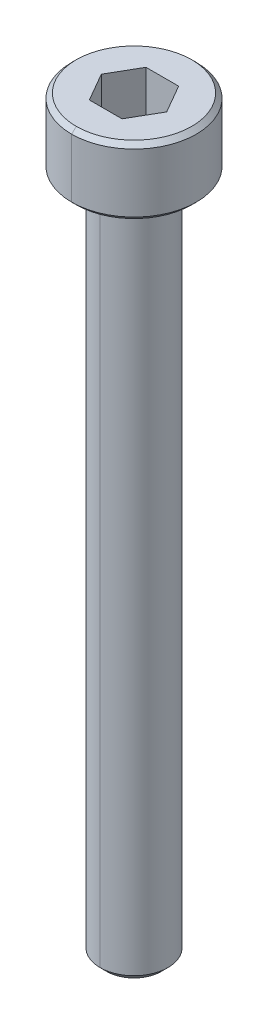
ISO-10303-21;
HEADER;
FILE_DESCRIPTION(('STEP AP214'),'2;1');
FILE_NAME('part.step','',(''),(''),'','','');
FILE_SCHEMA(('AUTOMOTIVE_DESIGN { 1 0 10303 214 1 1 1 1 }'));
ENDSEC;
DATA;
#1=APPLICATION_CONTEXT('core data for automotive mechanical design processes');
#2=APPLICATION_PROTOCOL_DEFINITION('international standard','automotive_design',2000,#1);
#3=PRODUCT_CONTEXT('',#1,'mechanical');
#4=PRODUCT('Part','Part','',(#3));
#5=PRODUCT_RELATED_PRODUCT_CATEGORY('part','',(#4));
#6=PRODUCT_DEFINITION_FORMATION('','',#4);
#7=PRODUCT_DEFINITION_CONTEXT('part definition',#1,'design');
#8=PRODUCT_DEFINITION('design','',#6,#7);
#9=PRODUCT_DEFINITION_SHAPE('','',#8);
#10=(LENGTH_UNIT() NAMED_UNIT(*) SI_UNIT(.MILLI.,.METRE.));
#11=(NAMED_UNIT(*) PLANE_ANGLE_UNIT() SI_UNIT($,.RADIAN.));
#12=(NAMED_UNIT(*) SI_UNIT($,.STERADIAN.) SOLID_ANGLE_UNIT());
#13=UNCERTAINTY_MEASURE_WITH_UNIT(LENGTH_MEASURE(1.E-05),#10,'distance_accuracy_value','');
#14=(GEOMETRIC_REPRESENTATION_CONTEXT(3) GLOBAL_UNCERTAINTY_ASSIGNED_CONTEXT((#13)) GLOBAL_UNIT_ASSIGNED_CONTEXT((#10,
#11,#12)) REPRESENTATION_CONTEXT('',''));
#15=CARTESIAN_POINT('',(0.,0.,0.));
#16=DIRECTION('',(0.,0.,1.));
#17=DIRECTION('',(1.,0.,0.));
#18=AXIS2_PLACEMENT_3D('',#15,#16,#17);
#19=CARTESIAN_POINT('',(0.721687836487033,31.,1.25));
#20=DIRECTION('',(0.866025403784439,0.,0.5));
#21=DIRECTION('',(0.5,0.,-0.866025403784439));
#22=AXIS2_PLACEMENT_3D('',#19,#20,#21);
#23=PLANE('',#22);
#24=DIRECTION('',(0.5,0.,-0.866025403784439));
#25=VECTOR('',#24,1.);
#26=CARTESIAN_POINT('',(0.721687836487033,31.,1.25));
#27=LINE('',#26,#25);
#28=CARTESIAN_POINT('',(0.721687836487033,31.,1.25));
#29=VERTEX_POINT('',#28);
#30=CARTESIAN_POINT('',(1.44337567297406,31.,0.));
#31=VERTEX_POINT('',#30);
#32=EDGE_CURVE('E179',#29,#31,#27,.T.);
#33=ORIENTED_EDGE('',*,*,#32,.F.);
#34=DIRECTION('',(0.,1.,0.));
#35=VECTOR('',#34,1.);
#36=CARTESIAN_POINT('',(0.721687836487033,31.,1.25));
#37=LINE('',#36,#35);
#38=CARTESIAN_POINT('',(0.721687836487033,33.,1.25));
#39=VERTEX_POINT('',#38);
#40=EDGE_CURVE('E167',#29,#39,#37,.T.);
#41=ORIENTED_EDGE('',*,*,#40,.T.);
#42=DIRECTION('',(0.5,0.,-0.866025403784439));
#43=VECTOR('',#42,1.);
#44=CARTESIAN_POINT('',(0.721687836487033,33.,1.25));
#45=LINE('',#44,#43);
#46=CARTESIAN_POINT('',(1.44337567297406,33.,0.));
#47=VERTEX_POINT('',#46);
#48=EDGE_CURVE('E181',#47,#39,#45,.F.);
#49=ORIENTED_EDGE('',*,*,#48,.F.);
#50=DIRECTION('',(0.,1.,0.));
#51=VECTOR('',#50,1.);
#52=CARTESIAN_POINT('',(1.44337567297406,31.,0.));
#53=LINE('',#52,#51);
#54=EDGE_CURVE('E174',#47,#31,#53,.F.);
#55=ORIENTED_EDGE('',*,*,#54,.T.);
#56=EDGE_LOOP('',(#33,#41,#49,#55));
#57=FACE_BOUND('',#56,.T.);
#58=ADVANCED_FACE('F17',(#57),#23,.F.);
#59=CARTESIAN_POINT('',(1.44337567297406,31.,0.));
#60=DIRECTION('',(0.866025403784438,0.,-0.5));
#61=DIRECTION('',(-0.5,0.,-0.866025403784438));
#62=AXIS2_PLACEMENT_3D('',#59,#60,#61);
#63=PLANE('',#62);
#64=DIRECTION('',(-0.5,0.,-0.866025403784438));
#65=VECTOR('',#64,1.);
#66=CARTESIAN_POINT('',(1.44337567297406,31.,0.));
#67=LINE('',#66,#65);
#68=CARTESIAN_POINT('',(0.721687836487031,31.,-1.25));
#69=VERTEX_POINT('',#68);
#70=EDGE_CURVE('E172',#31,#69,#67,.T.);
#71=ORIENTED_EDGE('',*,*,#70,.F.);
#72=ORIENTED_EDGE('',*,*,#54,.F.);
#73=DIRECTION('',(-0.5,0.,-0.866025403784438));
#74=VECTOR('',#73,1.);
#75=CARTESIAN_POINT('',(1.44337567297406,33.,0.));
#76=LINE('',#75,#74);
#77=CARTESIAN_POINT('',(0.721687836487032,33.,-1.25));
#78=VERTEX_POINT('',#77);
#79=EDGE_CURVE('E177',#78,#47,#76,.F.);
#80=ORIENTED_EDGE('',*,*,#79,.F.);
#81=DIRECTION('',(0.,1.,0.));
#82=VECTOR('',#81,1.);
#83=CARTESIAN_POINT('',(0.721687836487031,31.,-1.25));
#84=LINE('',#83,#82);
#85=EDGE_CURVE('E162',#78,#69,#84,.F.);
#86=ORIENTED_EDGE('',*,*,#85,.T.);
#87=EDGE_LOOP('',(#71,#72,#80,#86));
#88=FACE_BOUND('',#87,.T.);
#89=ADVANCED_FACE('F417',(#88),#63,.F.);
#90=CARTESIAN_POINT('',(-0.721687836487032,31.,1.25));
#91=DIRECTION('',(0.,0.,1.));
#92=DIRECTION('',(1.,0.,0.));
#93=AXIS2_PLACEMENT_3D('',#90,#91,#92);
#94=PLANE('',#93);
#95=DIRECTION('',(1.,0.,0.));
#96=VECTOR('',#95,1.);
#97=CARTESIAN_POINT('',(1.44337567297406,31.,1.25));
#98=LINE('',#97,#96);
#99=CARTESIAN_POINT('',(-0.721687836487032,31.,1.25));
#100=VERTEX_POINT('',#99);
#101=EDGE_CURVE('E159',#100,#29,#98,.T.);
#102=ORIENTED_EDGE('',*,*,#101,.F.);
#103=DIRECTION('',(0.,1.,0.));
#104=VECTOR('',#103,1.);
#105=CARTESIAN_POINT('',(-0.721687836487032,31.,1.25));
#106=LINE('',#105,#104);
#107=CARTESIAN_POINT('',(-0.721687836487032,33.,1.25));
#108=VERTEX_POINT('',#107);
#109=EDGE_CURVE('E148',#100,#108,#106,.T.);
#110=ORIENTED_EDGE('',*,*,#109,.T.);
#111=DIRECTION('',(1.,0.,0.));
#112=VECTOR('',#111,1.);
#113=CARTESIAN_POINT('',(-0.721687836487032,33.,1.25));
#114=LINE('',#113,#112);
#115=EDGE_CURVE('E170',#39,#108,#114,.F.);
#116=ORIENTED_EDGE('',*,*,#115,.F.);
#117=ORIENTED_EDGE('',*,*,#40,.F.);
#118=EDGE_LOOP('',(#102,#110,#116,#117));
#119=FACE_BOUND('',#118,.T.);
#120=ADVANCED_FACE('F408',(#119),#94,.F.);
#121=CARTESIAN_POINT('',(0.721687836487031,31.,-1.25));
#122=DIRECTION('',(0.,0.,-1.));
#123=DIRECTION('',(-1.,0.,0.));
#124=AXIS2_PLACEMENT_3D('',#121,#122,#123);
#125=PLANE('',#124);
#126=DIRECTION('',(1.,0.,0.));
#127=VECTOR('',#126,1.);
#128=CARTESIAN_POINT('',(1.44337567297406,31.,-1.25));
#129=LINE('',#128,#127);
#130=CARTESIAN_POINT('',(-0.721687836487032,31.,-1.25));
#131=VERTEX_POINT('',#130);
#132=EDGE_CURVE('E156',#69,#131,#129,.F.);
#133=ORIENTED_EDGE('',*,*,#132,.F.);
#134=ORIENTED_EDGE('',*,*,#85,.F.);
#135=DIRECTION('',(-1.,0.,0.));
#136=VECTOR('',#135,1.);
#137=CARTESIAN_POINT('',(0.721687836487031,33.,-1.25));
#138=LINE('',#137,#136);
#139=CARTESIAN_POINT('',(-0.721687836487032,33.,-1.25));
#140=VERTEX_POINT('',#139);
#141=EDGE_CURVE('E165',#140,#78,#138,.F.);
#142=ORIENTED_EDGE('',*,*,#141,.F.);
#143=DIRECTION('',(0.,1.,0.));
#144=VECTOR('',#143,1.);
#145=CARTESIAN_POINT('',(-0.721687836487032,31.,-1.25));
#146=LINE('',#145,#144);
#147=EDGE_CURVE('E146',#140,#131,#146,.F.);
#148=ORIENTED_EDGE('',*,*,#147,.T.);
#149=EDGE_LOOP('',(#133,#134,#142,#148));
#150=FACE_BOUND('',#149,.T.);
#151=ADVANCED_FACE('F399',(#150),#125,.F.);
#152=CARTESIAN_POINT('',(1.44337567297406,31.,0.));
#153=DIRECTION('',(0.,1.,0.));
#154=DIRECTION('',(0.,0.,1.));
#155=AXIS2_PLACEMENT_3D('',#152,#153,#154);
#156=PLANE('',#155);
#157=ORIENTED_EDGE('',*,*,#132,.T.);
#158=DIRECTION('',(-0.5,0.,0.866025403784439));
#159=VECTOR('',#158,1.);
#160=CARTESIAN_POINT('',(-0.721687836487032,31.,-1.25));
#161=LINE('',#160,#159);
#162=CARTESIAN_POINT('',(-1.44337567297406,31.,0.));
#163=VERTEX_POINT('',#162);
#164=EDGE_CURVE('E144',#131,#163,#161,.T.);
#165=ORIENTED_EDGE('',*,*,#164,.T.);
#166=DIRECTION('',(0.5,0.,0.866025403784438));
#167=VECTOR('',#166,1.);
#168=CARTESIAN_POINT('',(-1.44337567297406,31.,0.));
#169=LINE('',#168,#167);
#170=EDGE_CURVE('E151',#163,#100,#169,.T.);
#171=ORIENTED_EDGE('',*,*,#170,.T.);
#172=ORIENTED_EDGE('',*,*,#101,.T.);
#173=ORIENTED_EDGE('',*,*,#32,.T.);
#174=ORIENTED_EDGE('',*,*,#70,.T.);
#175=EDGE_LOOP('',(#157,#165,#171,#172,#173,#174));
#176=FACE_BOUND('',#175,.T.);
#177=ADVANCED_FACE('F390',(#176),#156,.T.);
#178=CARTESIAN_POINT('',(-1.44337567297406,31.,0.));
#179=DIRECTION('',(-0.866025403784438,0.,0.5));
#180=DIRECTION('',(0.5,0.,0.866025403784438));
#181=AXIS2_PLACEMENT_3D('',#178,#179,#180);
#182=PLANE('',#181);
#183=ORIENTED_EDGE('',*,*,#170,.F.);
#184=DIRECTION('',(0.,1.,0.));
#185=VECTOR('',#184,1.);
#186=CARTESIAN_POINT('',(-1.44337567297407,31.,0.));
#187=LINE('',#186,#185);
#188=CARTESIAN_POINT('',(-1.44337567297406,33.,0.));
#189=VERTEX_POINT('',#188);
#190=EDGE_CURVE('E141',#163,#189,#187,.T.);
#191=ORIENTED_EDGE('',*,*,#190,.T.);
#192=DIRECTION('',(0.5,0.,0.866025403784438));
#193=VECTOR('',#192,1.);
#194=CARTESIAN_POINT('',(-1.44337567297406,33.,0.));
#195=LINE('',#194,#193);
#196=EDGE_CURVE('E154',#108,#189,#195,.F.);
#197=ORIENTED_EDGE('',*,*,#196,.F.);
#198=ORIENTED_EDGE('',*,*,#109,.F.);
#199=EDGE_LOOP('',(#183,#191,#197,#198));
#200=FACE_BOUND('',#199,.T.);
#201=ADVANCED_FACE('F381',(#200),#182,.F.);
#202=CARTESIAN_POINT('',(-0.721687836487032,31.,-1.25));
#203=DIRECTION('',(-0.866025403784439,0.,-0.5));
#204=DIRECTION('',(-0.5,0.,0.866025403784439));
#205=AXIS2_PLACEMENT_3D('',#202,#203,#204);
#206=PLANE('',#205);
#207=ORIENTED_EDGE('',*,*,#164,.F.);
#208=ORIENTED_EDGE('',*,*,#147,.F.);
#209=DIRECTION('',(0.5,0.,-0.866025403784438));
#210=VECTOR('',#209,1.);
#211=CARTESIAN_POINT('',(-1.44337567297406,33.,0.));
#212=LINE('',#211,#210);
#213=EDGE_CURVE('E122',#189,#140,#212,.T.);
#214=ORIENTED_EDGE('',*,*,#213,.F.);
#215=ORIENTED_EDGE('',*,*,#190,.F.);
#216=EDGE_LOOP('',(#207,#208,#214,#215));
#217=FACE_BOUND('',#216,.T.);
#218=ADVANCED_FACE('F373',(#217),#206,.F.);
#219=CARTESIAN_POINT('',(0.,33.,-2.75));
#220=DIRECTION('',(0.,1.,0.));
#221=DIRECTION('',(0.,0.,1.));
#222=AXIS2_PLACEMENT_3D('',#219,#220,#221);
#223=PLANE('',#222);
#224=CARTESIAN_POINT('',(0.,33.0000000000155,0.));
#225=DIRECTION('',(0.,-1.,0.));
#226=DIRECTION('',(0.,0.,-1.));
#227=AXIS2_PLACEMENT_3D('',#224,#225,#226);
#228=CIRCLE('',#227,2.54999999992833);
#229=CARTESIAN_POINT('',(0.,33.0000000000155,-2.54999999992833));
#230=VERTEX_POINT('',#229);
#231=CARTESIAN_POINT('',(0.,33.0000000000155,2.54999999992833));
#232=VERTEX_POINT('',#231);
#233=EDGE_CURVE('E111',#230,#232,#228,.T.);
#234=ORIENTED_EDGE('',*,*,#233,.F.);
#235=CARTESIAN_POINT('',(0.,33.0000000000155,0.));
#236=DIRECTION('',(0.,-1.,0.));
#237=DIRECTION('',(0.,0.,-1.));
#238=AXIS2_PLACEMENT_3D('',#235,#236,#237);
#239=CIRCLE('',#238,2.54999999992833);
#240=EDGE_CURVE('E20',#232,#230,#239,.T.);
#241=ORIENTED_EDGE('',*,*,#240,.F.);
#242=EDGE_LOOP('',(#234,#241));
#243=FACE_BOUND('',#242,.T.);
#244=ORIENTED_EDGE('',*,*,#196,.T.);
#245=ORIENTED_EDGE('',*,*,#213,.T.);
#246=ORIENTED_EDGE('',*,*,#141,.T.);
#247=ORIENTED_EDGE('',*,*,#79,.T.);
#248=ORIENTED_EDGE('',*,*,#48,.T.);
#249=ORIENTED_EDGE('',*,*,#115,.T.);
#250=EDGE_LOOP('',(#244,#245,#246,#247,#248,#249));
#251=FACE_BOUND('',#250,.T.);
#252=ADVANCED_FACE('F112',(#243,#251),#223,.T.);
#253=CARTESIAN_POINT('',(0.,32.8000000000657,0.));
#254=DIRECTION('',(0.,-1.,0.));
#255=DIRECTION('',(0.,0.,-1.));
#256=AXIS2_PLACEMENT_3D('',#253,#254,#255);
#257=CONICAL_SURFACE('',#256,2.74999999987813,0.785398163397448);
#258=DIRECTION('',(0.,0.707106781186548,0.707106781186548));
#259=VECTOR('',#258,1.);
#260=CARTESIAN_POINT('',(0.,-498964.45,-499000.));
#261=LINE('',#260,#259);
#262=CARTESIAN_POINT('',(0.,32.8000000000164,-2.74999999996953));
#263=VERTEX_POINT('',#262);
#264=EDGE_CURVE('E120',#263,#230,#261,.T.);
#265=ORIENTED_EDGE('',*,*,#264,.F.);
#266=CARTESIAN_POINT('',(0.,32.8,0.));
#267=DIRECTION('',(0.,-1.,0.));
#268=DIRECTION('',(0.,0.,-1.));
#269=AXIS2_PLACEMENT_3D('',#266,#267,#268);
#270=CIRCLE('',#269,2.75);
#271=CARTESIAN_POINT('',(0.,32.8000000000164,2.74999999996953));
#272=VERTEX_POINT('',#271);
#273=EDGE_CURVE('E127',#272,#263,#270,.T.);
#274=ORIENTED_EDGE('',*,*,#273,.F.);
#275=DIRECTION('',(0.,0.707106781186548,-0.707106781186548));
#276=VECTOR('',#275,1.);
#277=CARTESIAN_POINT('',(6.11098752774529E-11,-498964.45,499000.));
#278=LINE('',#277,#276);
#279=EDGE_CURVE('E117',#232,#272,#278,.F.);
#280=ORIENTED_EDGE('',*,*,#279,.F.);
#281=ORIENTED_EDGE('',*,*,#240,.T.);
#282=EDGE_LOOP('',(#265,#274,#280,#281));
#283=FACE_BOUND('',#282,.T.);
#284=ADVANCED_FACE('F119',(#283),#257,.T.);
#285=CARTESIAN_POINT('',(0.,32.8000000000657,0.));
#286=DIRECTION('',(0.,-1.,0.));
#287=DIRECTION('',(0.,0.,-1.));
#288=AXIS2_PLACEMENT_3D('',#285,#286,#287);
#289=CONICAL_SURFACE('',#288,2.74999999987813,0.785398163397448);
#290=CARTESIAN_POINT('',(0.,32.8,0.));
#291=DIRECTION('',(0.,-1.,0.));
#292=DIRECTION('',(0.,0.,-1.));
#293=AXIS2_PLACEMENT_3D('',#290,#291,#292);
#294=CIRCLE('',#293,2.75);
#295=EDGE_CURVE('E125',#263,#272,#294,.T.);
#296=ORIENTED_EDGE('',*,*,#295,.F.);
#297=ORIENTED_EDGE('',*,*,#264,.T.);
#298=ORIENTED_EDGE('',*,*,#233,.T.);
#299=ORIENTED_EDGE('',*,*,#279,.T.);
#300=EDGE_LOOP('',(#296,#297,#298,#299));
#301=FACE_BOUND('',#300,.T.);
#302=ADVANCED_FACE('F123',(#301),#289,.T.);
#303=CARTESIAN_POINT('',(0.,0.,0.));
#304=DIRECTION('',(0.,-1.,0.));
#305=DIRECTION('',(0.,0.,-1.));
#306=AXIS2_PLACEMENT_3D('',#303,#304,#305);
#307=CYLINDRICAL_SURFACE('',#306,2.75);
#308=DIRECTION('',(0.,-1.,0.));
#309=VECTOR('',#308,1.);
#310=CARTESIAN_POINT('',(0.,0.,-2.75));
#311=LINE('',#310,#309);
#312=CARTESIAN_POINT('',(0.,30.199999999958,-2.75000000002228));
#313=VERTEX_POINT('',#312);
#314=EDGE_CURVE('E226',#313,#263,#311,.F.);
#315=ORIENTED_EDGE('',*,*,#314,.F.);
#316=CARTESIAN_POINT('',(0.,30.1999999999794,0.));
#317=DIRECTION('',(0.,1.,0.));
#318=DIRECTION('',(0.,0.,1.));
#319=AXIS2_PLACEMENT_3D('',#316,#317,#318);
#320=CIRCLE('',#319,2.75000000004866);
#321=CARTESIAN_POINT('',(0.,30.1999999999651,2.75000000002228));
#322=VERTEX_POINT('',#321);
#323=EDGE_CURVE('E221',#322,#313,#320,.F.);
#324=ORIENTED_EDGE('',*,*,#323,.F.);
#325=DIRECTION('',(0.,-1.,0.));
#326=VECTOR('',#325,1.);
#327=CARTESIAN_POINT('',(0.,0.,2.75));
#328=LINE('',#327,#326);
#329=EDGE_CURVE('E231',#272,#322,#328,.T.);
#330=ORIENTED_EDGE('',*,*,#329,.F.);
#331=ORIENTED_EDGE('',*,*,#273,.T.);
#332=EDGE_LOOP('',(#315,#324,#330,#331));
#333=FACE_BOUND('',#332,.T.);
#334=ADVANCED_FACE('F246',(#333),#307,.T.);
#335=CARTESIAN_POINT('',(0.,0.,0.));
#336=DIRECTION('',(0.,-1.,0.));
#337=DIRECTION('',(0.,0.,-1.));
#338=AXIS2_PLACEMENT_3D('',#335,#336,#337);
#339=CYLINDRICAL_SURFACE('',#338,2.75);
#340=CARTESIAN_POINT('',(0.,30.1999999999794,0.));
#341=DIRECTION('',(0.,1.,0.));
#342=DIRECTION('',(0.,0.,1.));
#343=AXIS2_PLACEMENT_3D('',#340,#341,#342);
#344=CIRCLE('',#343,2.75000000004866);
#345=EDGE_CURVE('E206',#313,#322,#344,.F.);
#346=ORIENTED_EDGE('',*,*,#345,.F.);
#347=ORIENTED_EDGE('',*,*,#314,.T.);
#348=ORIENTED_EDGE('',*,*,#295,.T.);
#349=ORIENTED_EDGE('',*,*,#329,.T.);
#350=EDGE_LOOP('',(#346,#347,#348,#349));
#351=FACE_BOUND('',#350,.T.);
#352=ADVANCED_FACE('F243',(#351),#339,.T.);
#353=CARTESIAN_POINT('',(0.,30.1999999999225,0.));
#354=DIRECTION('',(0.,1.,0.));
#355=DIRECTION('',(0.,0.,1.));
#356=AXIS2_PLACEMENT_3D('',#353,#354,#355);
#357=CONICAL_SURFACE('',#356,2.74999999999181,0.785398163397448);
#358=DIRECTION('',(0.,-0.707106781186548,-0.707106781186548));
#359=VECTOR('',#358,1.);
#360=CARTESIAN_POINT('',(0.,499000.,498972.55));
#361=LINE('',#360,#359);
#362=CARTESIAN_POINT('',(0.,29.9999999999727,2.55000000004202));
#363=VERTEX_POINT('',#362);
#364=EDGE_CURVE('E203',#322,#363,#361,.T.);
#365=ORIENTED_EDGE('',*,*,#364,.F.);
#366=ORIENTED_EDGE('',*,*,#323,.T.);
#367=DIRECTION('',(0.,-0.707106781186548,0.707106781186548));
#368=VECTOR('',#367,1.);
#369=CARTESIAN_POINT('',(6.11065136219893E-11,499000.,-498972.55));
#370=LINE('',#369,#368);
#371=CARTESIAN_POINT('',(0.,29.9999999999727,-2.55000000004202));
#372=VERTEX_POINT('',#371);
#373=EDGE_CURVE('E212',#372,#313,#370,.F.);
#374=ORIENTED_EDGE('',*,*,#373,.F.);
#375=CARTESIAN_POINT('',(0.,29.9999999999727,0.));
#376=DIRECTION('',(0.,1.,0.));
#377=DIRECTION('',(0.,0.,1.));
#378=AXIS2_PLACEMENT_3D('',#375,#376,#377);
#379=CIRCLE('',#378,2.55000000004202);
#380=EDGE_CURVE('E198',#363,#372,#379,.F.);
#381=ORIENTED_EDGE('',*,*,#380,.F.);
#382=EDGE_LOOP('',(#365,#366,#374,#381));
#383=FACE_BOUND('',#382,.T.);
#384=ADVANCED_FACE('F248',(#383),#357,.T.);
#385=CARTESIAN_POINT('',(0.,30.1999999999225,0.));
#386=DIRECTION('',(0.,1.,0.));
#387=DIRECTION('',(0.,0.,1.));
#388=AXIS2_PLACEMENT_3D('',#385,#386,#387);
#389=CONICAL_SURFACE('',#388,2.74999999999181,0.785398163397448);
#390=ORIENTED_EDGE('',*,*,#345,.T.);
#391=ORIENTED_EDGE('',*,*,#364,.T.);
#392=CARTESIAN_POINT('',(0.,29.9999999999727,0.));
#393=DIRECTION('',(0.,1.,0.));
#394=DIRECTION('',(0.,0.,1.));
#395=AXIS2_PLACEMENT_3D('',#392,#393,#394);
#396=CIRCLE('',#395,2.55000000004202);
#397=EDGE_CURVE('E195',#372,#363,#396,.F.);
#398=ORIENTED_EDGE('',*,*,#397,.F.);
#399=ORIENTED_EDGE('',*,*,#373,.T.);
#400=EDGE_LOOP('',(#390,#391,#398,#399));
#401=FACE_BOUND('',#400,.T.);
#402=ADVANCED_FACE('F249',(#401),#389,.T.);
#403=CARTESIAN_POINT('',(0.,0.,0.));
#404=DIRECTION('',(0.,-1.,0.));
#405=DIRECTION('',(0.,0.,-1.));
#406=AXIS2_PLACEMENT_3D('',#403,#404,#405);
#407=PLANE('',#406);
#408=CARTESIAN_POINT('',(0.,5.6843418860808E-11,0.));
#409=DIRECTION('',(0.,1.,0.));
#410=DIRECTION('',(0.,0.,1.));
#411=AXIS2_PLACEMENT_3D('',#408,#409,#410);
#412=CIRCLE('',#411,1.19999999992615);
#413=CARTESIAN_POINT('',(0.,5.6843418860808E-11,1.19999999992615));
#414=VERTEX_POINT('',#413);
#415=CARTESIAN_POINT('',(0.,5.6843418860808E-11,-1.19999999992615));
#416=VERTEX_POINT('',#415);
#417=EDGE_CURVE('E191',#414,#416,#412,.T.);
#418=ORIENTED_EDGE('',*,*,#417,.F.);
#419=CARTESIAN_POINT('',(0.,5.6843418860808E-11,0.));
#420=DIRECTION('',(0.,1.,0.));
#421=DIRECTION('',(0.,0.,1.));
#422=AXIS2_PLACEMENT_3D('',#419,#420,#421);
#423=CIRCLE('',#422,1.19999999992615);
#424=EDGE_CURVE('E201',#416,#414,#423,.T.);
#425=ORIENTED_EDGE('',*,*,#424,.F.);
#426=EDGE_LOOP('',(#418,#425));
#427=FACE_BOUND('',#426,.T.);
#428=ADVANCED_FACE('F271',(#427),#407,.T.);
#429=CARTESIAN_POINT('',(0.,0.300000000038381,0.));
#430=DIRECTION('',(0.,1.,0.));
#431=DIRECTION('',(0.,0.,1.));
#432=AXIS2_PLACEMENT_3D('',#429,#430,#431);
#433=CONICAL_SURFACE('',#432,1.49999999990769,0.785398163397448);
#434=DIRECTION('',(0.,-0.707106781186548,-0.707106781186547));
#435=VECTOR('',#434,1.);
#436=CARTESIAN_POINT('',(0.,498998.8,499000.));
#437=LINE('',#436,#435);
#438=CARTESIAN_POINT('',(0.,0.300000000023988,1.4999999999423));
#439=VERTEX_POINT('',#438);
#440=EDGE_CURVE('E190',#439,#414,#437,.T.);
#441=ORIENTED_EDGE('',*,*,#440,.F.);
#442=CARTESIAN_POINT('',(0.,0.299999999999999,0.));
#443=DIRECTION('',(0.,-1.,0.));
#444=DIRECTION('',(0.,0.,-1.));
#445=AXIS2_PLACEMENT_3D('',#442,#443,#444);
#446=CIRCLE('',#445,1.5);
#447=CARTESIAN_POINT('',(0.,0.300000000028785,-1.49999999993076));
#448=VERTEX_POINT('',#447);
#449=EDGE_CURVE('E35',#448,#439,#446,.F.);
#450=ORIENTED_EDGE('',*,*,#449,.F.);
#451=DIRECTION('',(0.,-0.707106781186548,0.707106781186547));
#452=VECTOR('',#451,1.);
#453=CARTESIAN_POINT('',(6.11098752774529E-11,498998.8,-499000.));
#454=LINE('',#453,#452);
#455=EDGE_CURVE('E194',#416,#448,#454,.F.);
#456=ORIENTED_EDGE('',*,*,#455,.F.);
#457=ORIENTED_EDGE('',*,*,#424,.T.);
#458=EDGE_LOOP('',(#441,#450,#456,#457));
#459=FACE_BOUND('',#458,.T.);
#460=ADVANCED_FACE('F255',(#459),#433,.T.);
#461=CARTESIAN_POINT('',(0.,30.,-1.5));
#462=DIRECTION('',(0.,-1.,0.));
#463=DIRECTION('',(0.,0.,-1.));
#464=AXIS2_PLACEMENT_3D('',#461,#462,#463);
#465=PLANE('',#464);
#466=ORIENTED_EDGE('',*,*,#380,.T.);
#467=ORIENTED_EDGE('',*,*,#397,.T.);
#468=EDGE_LOOP('',(#466,#467));
#469=FACE_BOUND('',#468,.T.);
#470=CARTESIAN_POINT('',(0.,30.,0.));
#471=DIRECTION('',(0.,-1.,0.));
#472=DIRECTION('',(0.,0.,-1.));
#473=AXIS2_PLACEMENT_3D('',#470,#471,#472);
#474=CIRCLE('',#473,1.5);
#475=CARTESIAN_POINT('',(0.,30.,-1.5));
#476=VERTEX_POINT('',#475);
#477=CARTESIAN_POINT('',(0.,30.,1.5));
#478=VERTEX_POINT('',#477);
#479=EDGE_CURVE('E183',#476,#478,#474,.T.);
#480=ORIENTED_EDGE('',*,*,#479,.F.);
#481=CARTESIAN_POINT('',(0.,30.,0.));
#482=DIRECTION('',(0.,-1.,0.));
#483=DIRECTION('',(0.,0.,-1.));
#484=AXIS2_PLACEMENT_3D('',#481,#482,#483);
#485=CIRCLE('',#484,1.5);
#486=EDGE_CURVE('E187',#478,#476,#485,.T.);
#487=ORIENTED_EDGE('',*,*,#486,.F.);
#488=EDGE_LOOP('',(#480,#487));
#489=FACE_BOUND('',#488,.T.);
#490=ADVANCED_FACE('F251',(#469,#489),#465,.T.);
#491=CARTESIAN_POINT('',(0.,0.300000000038381,0.));
#492=DIRECTION('',(0.,1.,0.));
#493=DIRECTION('',(0.,0.,1.));
#494=AXIS2_PLACEMENT_3D('',#491,#492,#493);
#495=CONICAL_SURFACE('',#494,1.49999999990769,0.785398163397448);
#496=CARTESIAN_POINT('',(0.,0.299999999999999,0.));
#497=DIRECTION('',(0.,-1.,0.));
#498=DIRECTION('',(0.,0.,-1.));
#499=AXIS2_PLACEMENT_3D('',#496,#497,#498);
#500=CIRCLE('',#499,1.5);
#501=EDGE_CURVE('E26',#439,#448,#500,.F.);
#502=ORIENTED_EDGE('',*,*,#501,.F.);
#503=ORIENTED_EDGE('',*,*,#440,.T.);
#504=ORIENTED_EDGE('',*,*,#417,.T.);
#505=ORIENTED_EDGE('',*,*,#455,.T.);
#506=EDGE_LOOP('',(#502,#503,#504,#505));
#507=FACE_BOUND('',#506,.T.);
#508=ADVANCED_FACE('F254',(#507),#495,.T.);
#509=CARTESIAN_POINT('',(0.,0.,0.));
#510=DIRECTION('',(0.,-1.,0.));
#511=DIRECTION('',(0.,0.,-1.));
#512=AXIS2_PLACEMENT_3D('',#509,#510,#511);
#513=CYLINDRICAL_SURFACE('',#512,1.5);
#514=DIRECTION('',(0.,-1.,0.));
#515=VECTOR('',#514,1.);
#516=CARTESIAN_POINT('',(0.,0.,-1.5));
#517=LINE('',#516,#515);
#518=EDGE_CURVE('E11',#448,#476,#517,.F.);
#519=ORIENTED_EDGE('',*,*,#518,.F.);
#520=ORIENTED_EDGE('',*,*,#449,.T.);
#521=DIRECTION('',(0.,-1.,0.));
#522=VECTOR('',#521,1.);
#523=CARTESIAN_POINT('',(0.,0.,1.5));
#524=LINE('',#523,#522);
#525=EDGE_CURVE('E186',#478,#439,#524,.T.);
#526=ORIENTED_EDGE('',*,*,#525,.F.);
#527=ORIENTED_EDGE('',*,*,#486,.T.);
#528=EDGE_LOOP('',(#519,#520,#526,#527));
#529=FACE_BOUND('',#528,.T.);
#530=ADVANCED_FACE('F262',(#529),#513,.T.);
#531=CARTESIAN_POINT('',(0.,0.,0.));
#532=DIRECTION('',(0.,-1.,0.));
#533=DIRECTION('',(0.,0.,-1.));
#534=AXIS2_PLACEMENT_3D('',#531,#532,#533);
#535=CYLINDRICAL_SURFACE('',#534,1.5);
#536=ORIENTED_EDGE('',*,*,#501,.T.);
#537=ORIENTED_EDGE('',*,*,#518,.T.);
#538=ORIENTED_EDGE('',*,*,#479,.T.);
#539=ORIENTED_EDGE('',*,*,#525,.T.);
#540=EDGE_LOOP('',(#536,#537,#538,#539));
#541=FACE_BOUND('',#540,.T.);
#542=ADVANCED_FACE('F264',(#541),#535,.T.);
#543=CLOSED_SHELL('',(#58,#89,#120,#151,#177,#201,#218,#252,#284,#302,#334,#352,#384,#402,#428,
#460,#490,#508,#530,#542));
#544=MANIFOLD_SOLID_BREP('B1',#543);
#545=ADVANCED_BREP_SHAPE_REPRESENTATION('',(#18,#544),#14);
#546=SHAPE_DEFINITION_REPRESENTATION(#9,#545);
ENDSEC;
END-ISO-10303-21;
